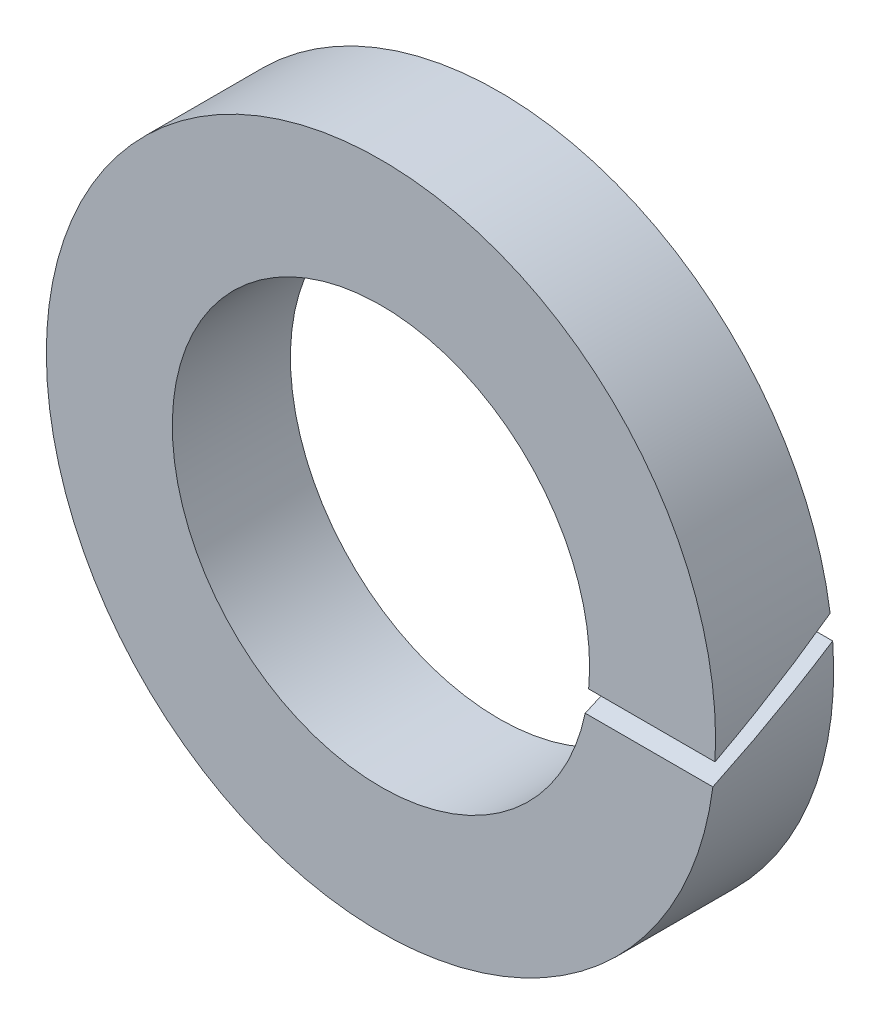
ISO-10303-21;
HEADER;
FILE_DESCRIPTION(('STEP AP214'),'2;1');
FILE_NAME('part.step','',(''),(''),'','','');
FILE_SCHEMA(('AUTOMOTIVE_DESIGN { 1 0 10303 214 1 1 1 1 }'));
ENDSEC;
DATA;
#1=APPLICATION_CONTEXT('core data for automotive mechanical design processes');
#2=APPLICATION_PROTOCOL_DEFINITION('international standard','automotive_design',2000,#1);
#3=PRODUCT_CONTEXT('',#1,'mechanical');
#4=PRODUCT('Part','Part','',(#3));
#5=PRODUCT_RELATED_PRODUCT_CATEGORY('part','',(#4));
#6=PRODUCT_DEFINITION_FORMATION('','',#4);
#7=PRODUCT_DEFINITION_CONTEXT('part definition',#1,'design');
#8=PRODUCT_DEFINITION('design','',#6,#7);
#9=PRODUCT_DEFINITION_SHAPE('','',#8);
#10=(LENGTH_UNIT() NAMED_UNIT(*) SI_UNIT(.MILLI.,.METRE.));
#11=(NAMED_UNIT(*) PLANE_ANGLE_UNIT() SI_UNIT($,.RADIAN.));
#12=(NAMED_UNIT(*) SI_UNIT($,.STERADIAN.) SOLID_ANGLE_UNIT());
#13=UNCERTAINTY_MEASURE_WITH_UNIT(LENGTH_MEASURE(1.E-05),#10,'distance_accuracy_value','');
#14=(GEOMETRIC_REPRESENTATION_CONTEXT(3) GLOBAL_UNCERTAINTY_ASSIGNED_CONTEXT((#13)) GLOBAL_UNIT_ASSIGNED_CONTEXT((#10,
#11,#12)) REPRESENTATION_CONTEXT('',''));
#15=CARTESIAN_POINT('',(0.,0.,0.));
#16=DIRECTION('',(0.,0.,1.));
#17=DIRECTION('',(1.,0.,0.));
#18=AXIS2_PLACEMENT_3D('',#15,#16,#17);
#19=CARTESIAN_POINT('',(0.,0.,1.5));
#20=DIRECTION('',(0.,0.,1.));
#21=DIRECTION('',(1.,0.,0.));
#22=AXIS2_PLACEMENT_3D('',#19,#20,#21);
#23=PLANE('',#22);
#24=CARTESIAN_POINT('',(0.,0.,1.5));
#25=DIRECTION('',(0.,0.,1.));
#26=DIRECTION('',(1.,0.,0.));
#27=AXIS2_PLACEMENT_3D('',#24,#25,#26);
#28=CIRCLE('',#27,4.25);
#29=CARTESIAN_POINT('',(4.24252930258183,-0.251883141028836,1.5));
#30=VERTEX_POINT('',#29);
#31=CARTESIAN_POINT('',(4.21548297952379,-0.540558275623648,1.5));
#32=VERTEX_POINT('',#31);
#33=EDGE_CURVE('E403',#30,#32,#28,.T.);
#34=ORIENTED_EDGE('',*,*,#33,.T.);
#35=DIRECTION('',(-1.,0.,0.));
#36=VECTOR('',#35,1.);
#37=CARTESIAN_POINT('',(4.25,-0.540558275623648,1.5));
#38=LINE('',#37,#36);
#39=CARTESIAN_POINT('',(2.59428154806967,-0.540558275623648,1.5));
#40=VERTEX_POINT('',#39);
#41=EDGE_CURVE('E397',#32,#40,#38,.T.);
#42=ORIENTED_EDGE('',*,*,#41,.T.);
#43=CARTESIAN_POINT('',(0.,0.,1.5));
#44=DIRECTION('',(0.,0.,1.));
#45=DIRECTION('',(1.,0.,0.));
#46=AXIS2_PLACEMENT_3D('',#43,#44,#45);
#47=CIRCLE('',#46,2.65);
#48=CARTESIAN_POINT('',(2.63800206278643,-0.251883141028836,1.5));
#49=VERTEX_POINT('',#48);
#50=EDGE_CURVE('E405',#49,#40,#47,.T.);
#51=ORIENTED_EDGE('',*,*,#50,.F.);
#52=DIRECTION('',(-1.,0.,0.));
#53=VECTOR('',#52,1.);
#54=CARTESIAN_POINT('',(4.25,-0.251883141028836,1.5));
#55=LINE('',#54,#53);
#56=EDGE_CURVE('E372',#30,#49,#55,.T.);
#57=ORIENTED_EDGE('',*,*,#56,.F.);
#58=EDGE_LOOP('',(#34,#42,#51,#57));
#59=FACE_BOUND('',#58,.T.);
#60=ADVANCED_FACE('F350',(#59),#23,.T.);
#61=CARTESIAN_POINT('',(0.,0.,0.));
#62=DIRECTION('',(0.,0.,1.));
#63=DIRECTION('',(1.,0.,0.));
#64=AXIS2_PLACEMENT_3D('',#61,#62,#63);
#65=PLANE('',#64);
#66=DIRECTION('',(-1.,0.,0.));
#67=VECTOR('',#66,1.);
#68=CARTESIAN_POINT('',(4.25,0.325467128160779,0.));
#69=LINE('',#68,#67);
#70=CARTESIAN_POINT('',(4.23751945700392,0.325467128160779,0.));
#71=VERTEX_POINT('',#70);
#72=CARTESIAN_POINT('',(2.6299374799578,0.325467128160779,0.));
#73=VERTEX_POINT('',#72);
#74=EDGE_CURVE('E365',#71,#73,#69,.T.);
#75=ORIENTED_EDGE('',*,*,#74,.F.);
#76=CARTESIAN_POINT('',(0.,0.,0.));
#77=DIRECTION('',(0.,0.,1.));
#78=DIRECTION('',(1.,0.,0.));
#79=AXIS2_PLACEMENT_3D('',#76,#77,#78);
#80=CIRCLE('',#79,4.25);
#81=CARTESIAN_POINT('',(4.20539288070656,0.614142262755591,0.));
#82=VERTEX_POINT('',#81);
#83=EDGE_CURVE('E408',#82,#71,#80,.T.);
#84=ORIENTED_EDGE('',*,*,#83,.F.);
#85=DIRECTION('',(-1.,0.,0.));
#86=VECTOR('',#85,1.);
#87=CARTESIAN_POINT('',(4.25,0.614142262755591,0.));
#88=LINE('',#87,#86);
#89=CARTESIAN_POINT('',(2.57785361902057,0.614142262755591,0.));
#90=VERTEX_POINT('',#89);
#91=EDGE_CURVE('E391',#82,#90,#88,.T.);
#92=ORIENTED_EDGE('',*,*,#91,.T.);
#93=CARTESIAN_POINT('',(0.,0.,0.));
#94=DIRECTION('',(0.,0.,1.));
#95=DIRECTION('',(1.,0.,0.));
#96=AXIS2_PLACEMENT_3D('',#93,#94,#95);
#97=CIRCLE('',#96,2.65);
#98=EDGE_CURVE('E413',#90,#73,#97,.T.);
#99=ORIENTED_EDGE('',*,*,#98,.T.);
#100=EDGE_LOOP('',(#75,#84,#92,#99));
#101=FACE_BOUND('',#100,.T.);
#102=ADVANCED_FACE('F421',(#101),#65,.F.);
#103=CARTESIAN_POINT('',(0.,0.,1.5));
#104=DIRECTION('',(0.,0.,-1.));
#105=DIRECTION('',(-1.,0.,0.));
#106=AXIS2_PLACEMENT_3D('',#103,#104,#105);
#107=CYLINDRICAL_SURFACE('',#106,4.25);
#108=CARTESIAN_POINT('',(0.,0.,0.563725602168009));
#109=DIRECTION('',(0.,0.866025403784442,0.499999999999995));
#110=DIRECTION('',(0.,0.499999999999995,-0.866025403784441));
#111=AXIS2_PLACEMENT_3D('',#108,#109,#110);
#112=ELLIPSE('',#111,8.50000000000009,4.25);
#113=EDGE_CURVE('E396',#32,#71,#112,.T.);
#114=ORIENTED_EDGE('',*,*,#113,.F.);
#115=ORIENTED_EDGE('',*,*,#33,.F.);
#116=CARTESIAN_POINT('',(0.,0.,1.06372560216801));
#117=DIRECTION('',(0.,-0.866025403784442,-0.499999999999995));
#118=DIRECTION('',(0.,0.499999999999995,-0.866025403784442));
#119=AXIS2_PLACEMENT_3D('',#116,#117,#118);
#120=ELLIPSE('',#119,8.50000000000008,4.25);
#121=EDGE_CURVE('E388',#82,#30,#120,.T.);
#122=ORIENTED_EDGE('',*,*,#121,.F.);
#123=ORIENTED_EDGE('',*,*,#83,.T.);
#124=EDGE_LOOP('',(#114,#115,#122,#123));
#125=FACE_BOUND('',#124,.T.);
#126=ADVANCED_FACE('F352',(#125),#107,.T.);
#127=CARTESIAN_POINT('',(0.,0.,1.5));
#128=DIRECTION('',(0.,0.,-1.));
#129=DIRECTION('',(-1.,0.,0.));
#130=AXIS2_PLACEMENT_3D('',#127,#128,#129);
#131=CYLINDRICAL_SURFACE('',#130,2.65);
#132=ORIENTED_EDGE('',*,*,#50,.T.);
#133=CARTESIAN_POINT('',(0.,0.,0.563725602168009));
#134=DIRECTION('',(0.,0.866025403784442,0.499999999999995));
#135=DIRECTION('',(0.,0.499999999999995,-0.866025403784441));
#136=AXIS2_PLACEMENT_3D('',#133,#134,#135);
#137=ELLIPSE('',#136,5.30000000000005,2.65);
#138=EDGE_CURVE('E11',#40,#73,#137,.T.);
#139=ORIENTED_EDGE('',*,*,#138,.T.);
#140=ORIENTED_EDGE('',*,*,#98,.F.);
#141=CARTESIAN_POINT('',(0.,0.,1.06372560216801));
#142=DIRECTION('',(0.,-0.866025403784442,-0.499999999999995));
#143=DIRECTION('',(0.,0.499999999999995,-0.866025403784442));
#144=AXIS2_PLACEMENT_3D('',#141,#142,#143);
#145=ELLIPSE('',#144,5.30000000000005,2.65);
#146=EDGE_CURVE('E358',#90,#49,#145,.T.);
#147=ORIENTED_EDGE('',*,*,#146,.T.);
#148=EDGE_LOOP('',(#132,#139,#140,#147));
#149=FACE_BOUND('',#148,.T.);
#150=ADVANCED_FACE('F423',(#149),#131,.F.);
#151=CARTESIAN_POINT('',(4.25,-0.251883141028836,1.5));
#152=DIRECTION('',(0.,-0.866025403784442,-0.499999999999995));
#153=DIRECTION('',(0.,0.499999999999995,-0.866025403784442));
#154=AXIS2_PLACEMENT_3D('',#151,#152,#153);
#155=PLANE('',#154);
#156=ORIENTED_EDGE('',*,*,#121,.T.);
#157=ORIENTED_EDGE('',*,*,#56,.T.);
#158=ORIENTED_EDGE('',*,*,#146,.F.);
#159=ORIENTED_EDGE('',*,*,#91,.F.);
#160=EDGE_LOOP('',(#156,#157,#158,#159));
#161=FACE_BOUND('',#160,.T.);
#162=ADVANCED_FACE('F389',(#161),#155,.T.);
#163=CARTESIAN_POINT('',(4.25,-0.540558275623648,1.5));
#164=DIRECTION('',(0.,0.866025403784442,0.499999999999995));
#165=DIRECTION('',(0.,-0.499999999999995,0.866025403784441));
#166=AXIS2_PLACEMENT_3D('',#163,#164,#165);
#167=PLANE('',#166);
#168=ORIENTED_EDGE('',*,*,#113,.T.);
#169=ORIENTED_EDGE('',*,*,#74,.T.);
#170=ORIENTED_EDGE('',*,*,#138,.F.);
#171=ORIENTED_EDGE('',*,*,#41,.F.);
#172=EDGE_LOOP('',(#168,#169,#170,#171));
#173=FACE_BOUND('',#172,.T.);
#174=ADVANCED_FACE('F424',(#173),#167,.T.);
#175=CLOSED_SHELL('',(#60,#102,#126,#150,#162,#174));
#176=MANIFOLD_SOLID_BREP('B2',#175);
#177=ADVANCED_BREP_SHAPE_REPRESENTATION('',(#18,#176),#14);
#178=SHAPE_DEFINITION_REPRESENTATION(#9,#177);
ENDSEC;
END-ISO-10303-21;
